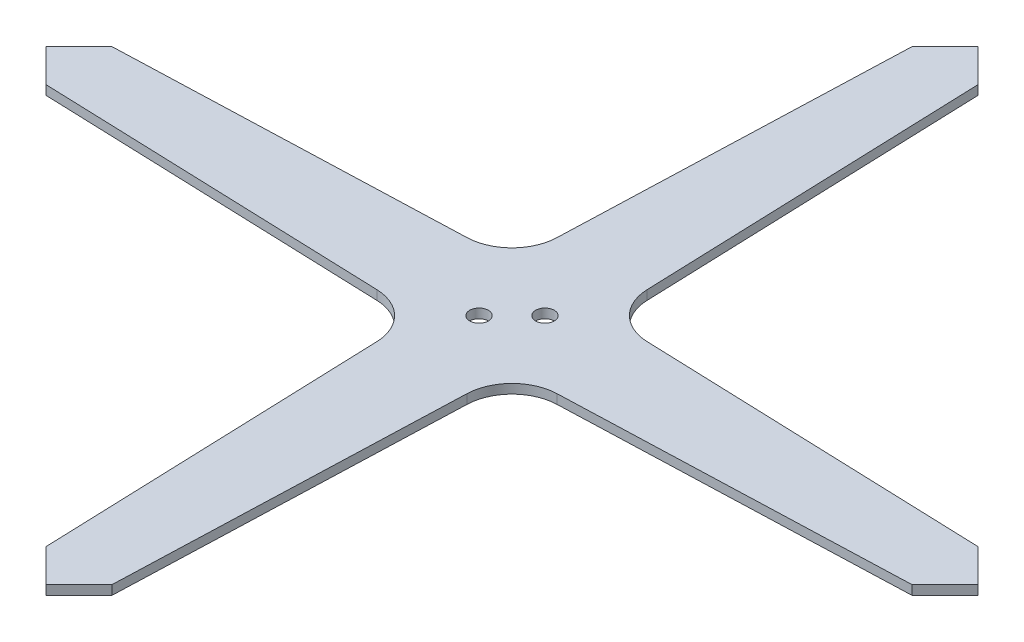
ISO-10303-21;
HEADER;
FILE_DESCRIPTION(('STEP AP214'),'2;1');
FILE_NAME('part.step','',(''),(''),'','','');
FILE_SCHEMA(('AUTOMOTIVE_DESIGN { 1 0 10303 214 1 1 1 1 }'));
ENDSEC;
DATA;
#1=APPLICATION_CONTEXT('core data for automotive mechanical design processes');
#2=APPLICATION_PROTOCOL_DEFINITION('international standard','automotive_design',2000,#1);
#3=PRODUCT_CONTEXT('',#1,'mechanical');
#4=PRODUCT('Part','Part','',(#3));
#5=PRODUCT_RELATED_PRODUCT_CATEGORY('part','',(#4));
#6=PRODUCT_DEFINITION_FORMATION('','',#4);
#7=PRODUCT_DEFINITION_CONTEXT('part definition',#1,'design');
#8=PRODUCT_DEFINITION('design','',#6,#7);
#9=PRODUCT_DEFINITION_SHAPE('','',#8);
#10=(LENGTH_UNIT() NAMED_UNIT(*) SI_UNIT(.MILLI.,.METRE.));
#11=(NAMED_UNIT(*) PLANE_ANGLE_UNIT() SI_UNIT($,.RADIAN.));
#12=(NAMED_UNIT(*) SI_UNIT($,.STERADIAN.) SOLID_ANGLE_UNIT());
#13=UNCERTAINTY_MEASURE_WITH_UNIT(LENGTH_MEASURE(1.E-05),#10,'distance_accuracy_value','');
#14=(GEOMETRIC_REPRESENTATION_CONTEXT(3) GLOBAL_UNCERTAINTY_ASSIGNED_CONTEXT((#13)) GLOBAL_UNIT_ASSIGNED_CONTEXT((#10,
#11,#12)) REPRESENTATION_CONTEXT('',''));
#15=CARTESIAN_POINT('',(0.,0.,0.));
#16=DIRECTION('',(0.,0.,1.));
#17=DIRECTION('',(1.,0.,0.));
#18=AXIS2_PLACEMENT_3D('',#15,#16,#17);
#19=CARTESIAN_POINT('',(0.,3.,0.));
#20=DIRECTION('',(0.,1.,0.));
#21=DIRECTION('',(0.,0.,1.));
#22=AXIS2_PLACEMENT_3D('',#19,#20,#21);
#23=PLANE('',#22);
#24=CARTESIAN_POINT('',(-276.5633008589,3.,5.30330085890187));
#25=DIRECTION('',(0.,1.,0.));
#26=DIRECTION('',(0.,0.,1.));
#27=AXIS2_PLACEMENT_3D('',#24,#25,#26);
#28=CIRCLE('',#27,2.99999999999994);
#29=CARTESIAN_POINT('',(-276.5633008589,3.,8.30330085890181));
#30=VERTEX_POINT('',#29);
#31=EDGE_CURVE('E231',#30,#30,#28,.T.);
#32=ORIENTED_EDGE('',*,*,#31,.F.);
#33=EDGE_LOOP('',(#32));
#34=FACE_BOUND('',#33,.T.);
#35=DIRECTION('',(-0.0352965731020605,0.,0.999376881825496));
#36=VECTOR('',#35,1.);
#37=CARTESIAN_POINT('',(-281.866601717798,3.,-139.393398282199));
#38=LINE('',#37,#36);
#39=CARTESIAN_POINT('',(-281.866601717798,3.,-139.393398282199));
#40=VERTEX_POINT('',#39);
#41=CARTESIAN_POINT('',(-285.766674338683,3.,-28.9678789695326));
#42=VERTEX_POINT('',#41);
#43=EDGE_CURVE('E181',#40,#42,#38,.T.);
#44=ORIENTED_EDGE('',*,*,#43,.T.);
#45=CARTESIAN_POINT('',(-300.757327566065,3.,-29.4973275660635));
#46=DIRECTION('',(0.,1.,0.));
#47=DIRECTION('',(0.,0.,1.));
#48=AXIS2_PLACEMENT_3D('',#45,#46,#47);
#49=CIRCLE('',#48,15.);
#50=CARTESIAN_POINT('',(-300.227878969534,3.,-14.5066743386811));
#51=VERTEX_POINT('',#50);
#52=EDGE_CURVE('E177',#42,#51,#49,.F.);
#53=ORIENTED_EDGE('',*,*,#52,.T.);
#54=DIRECTION('',(-0.999376881825495,0.,0.0352965731020729));
#55=VECTOR('',#54,1.);
#56=CARTESIAN_POINT('',(-286.259999999997,3.,-14.9999999999957));
#57=LINE('',#56,#55);
#58=CARTESIAN_POINT('',(-410.653398282202,3.,-10.6066017177952));
#59=VERTEX_POINT('',#58);
#60=EDGE_CURVE('E169',#51,#59,#57,.T.);
#61=ORIENTED_EDGE('',*,*,#60,.T.);
#62=DIRECTION('',(-0.70710678118655,0.,0.707106781186545));
#63=VECTOR('',#62,1.);
#64=CARTESIAN_POINT('',(-421.26,3.,3.04270497686332E-12));
#65=LINE('',#64,#63);
#66=CARTESIAN_POINT('',(-421.26,3.,3.04270497686332E-12));
#67=VERTEX_POINT('',#66);
#68=EDGE_CURVE('E174',#59,#67,#65,.T.);
#69=ORIENTED_EDGE('',*,*,#68,.T.);
#70=DIRECTION('',(0.70710678118655,0.,0.707106781186545));
#71=VECTOR('',#70,1.);
#72=CARTESIAN_POINT('',(-410.653398282202,3.,10.6066017178012));
#73=LINE('',#72,#71);
#74=CARTESIAN_POINT('',(-410.653398282202,3.,10.6066017178012));
#75=VERTEX_POINT('',#74);
#76=EDGE_CURVE('E196',#67,#75,#73,.T.);
#77=ORIENTED_EDGE('',*,*,#76,.T.);
#78=DIRECTION('',(0.999376881825496,0.,0.03529657310206));
#79=VECTOR('',#78,1.);
#80=CARTESIAN_POINT('',(-410.653398282202,3.,10.6066017178012));
#81=LINE('',#80,#79);
#82=CARTESIAN_POINT('',(-300.227878969536,3.,14.5066743386857));
#83=VERTEX_POINT('',#82);
#84=EDGE_CURVE('E198',#75,#83,#81,.T.);
#85=ORIENTED_EDGE('',*,*,#84,.T.);
#86=CARTESIAN_POINT('',(-300.757327566067,3.,29.4973275660681));
#87=DIRECTION('',(0.,1.,0.));
#88=DIRECTION('',(0.,0.,1.));
#89=AXIS2_PLACEMENT_3D('',#86,#87,#88);
#90=CIRCLE('',#89,15.);
#91=CARTESIAN_POINT('',(-285.766674338684,3.,28.967878969537));
#92=VERTEX_POINT('',#91);
#93=EDGE_CURVE('E319',#83,#92,#90,.F.);
#94=ORIENTED_EDGE('',*,*,#93,.T.);
#95=DIRECTION('',(0.0352965731020734,0.,0.999376881825495));
#96=VECTOR('',#95,1.);
#97=CARTESIAN_POINT('',(-286.259999999999,3.,15.0000000000002));
#98=LINE('',#97,#96);
#99=CARTESIAN_POINT('',(-281.866601717798,3.,139.393398282205));
#100=VERTEX_POINT('',#99);
#101=EDGE_CURVE('E204',#92,#100,#98,.T.);
#102=ORIENTED_EDGE('',*,*,#101,.T.);
#103=DIRECTION('',(0.707106781186542,0.,0.707106781186553));
#104=VECTOR('',#103,1.);
#105=CARTESIAN_POINT('',(-271.26,3.,150.000000000003));
#106=LINE('',#105,#104);
#107=CARTESIAN_POINT('',(-271.26,3.,150.000000000003));
#108=VERTEX_POINT('',#107);
#109=EDGE_CURVE('E206',#100,#108,#106,.T.);
#110=ORIENTED_EDGE('',*,*,#109,.T.);
#111=DIRECTION('',(0.707106781186544,0.,-0.707106781186551));
#112=VECTOR('',#111,1.);
#113=CARTESIAN_POINT('',(-260.653398282202,3.,139.393398282205));
#114=LINE('',#113,#112);
#115=CARTESIAN_POINT('',(-260.653398282202,3.,139.393398282205));
#116=VERTEX_POINT('',#115);
#117=EDGE_CURVE('E208',#108,#116,#114,.T.);
#118=ORIENTED_EDGE('',*,*,#117,.T.);
#119=DIRECTION('',(0.0352965731020596,0.,-0.999376881825496));
#120=VECTOR('',#119,1.);
#121=CARTESIAN_POINT('',(-260.653398282202,3.,139.393398282205));
#122=LINE('',#121,#120);
#123=CARTESIAN_POINT('',(-256.753325661317,3.,28.9678789695386));
#124=VERTEX_POINT('',#123);
#125=EDGE_CURVE('E210',#116,#124,#122,.T.);
#126=ORIENTED_EDGE('',*,*,#125,.T.);
#127=CARTESIAN_POINT('',(-241.762672433935,3.,29.4973275660695));
#128=DIRECTION('',(0.,1.,0.));
#129=DIRECTION('',(0.,0.,1.));
#130=AXIS2_PLACEMENT_3D('',#127,#128,#129);
#131=CIRCLE('',#130,15.);
#132=CARTESIAN_POINT('',(-242.292121030466,3.,14.5066743386871));
#133=VERTEX_POINT('',#132);
#134=EDGE_CURVE('E11',#124,#133,#131,.F.);
#135=ORIENTED_EDGE('',*,*,#134,.T.);
#136=DIRECTION('',(0.999376881825495,0.,-0.0352965731020731));
#137=VECTOR('',#136,1.);
#138=CARTESIAN_POINT('',(-256.260000000003,3.,15.0000000000017));
#139=LINE('',#138,#137);
#140=CARTESIAN_POINT('',(-131.866601717798,3.,10.6066017178011));
#141=VERTEX_POINT('',#140);
#142=EDGE_CURVE('E212',#133,#141,#139,.T.);
#143=ORIENTED_EDGE('',*,*,#142,.T.);
#144=DIRECTION('',(0.707106781186551,0.,-0.707106781186544));
#145=VECTOR('',#144,1.);
#146=CARTESIAN_POINT('',(-121.26,3.,2.98686856498032E-12));
#147=LINE('',#146,#145);
#148=CARTESIAN_POINT('',(-121.26,3.,2.98686856498032E-12));
#149=VERTEX_POINT('',#148);
#150=EDGE_CURVE('E214',#141,#149,#147,.T.);
#151=ORIENTED_EDGE('',*,*,#150,.T.);
#152=DIRECTION('',(-0.707106781186552,0.,-0.707106781186543));
#153=VECTOR('',#152,1.);
#154=CARTESIAN_POINT('',(-131.866601717798,3.,-10.6066017177953));
#155=LINE('',#154,#153);
#156=CARTESIAN_POINT('',(-131.866601717798,3.,-10.6066017177953));
#157=VERTEX_POINT('',#156);
#158=EDGE_CURVE('E216',#149,#157,#155,.T.);
#159=ORIENTED_EDGE('',*,*,#158,.T.);
#160=DIRECTION('',(-0.999376881825496,0.,-0.0352965731020599));
#161=VECTOR('',#160,1.);
#162=CARTESIAN_POINT('',(-131.866601717798,3.,-10.6066017177953));
#163=LINE('',#162,#161);
#164=CARTESIAN_POINT('',(-242.292121030465,3.,-14.5066743386797));
#165=VERTEX_POINT('',#164);
#166=EDGE_CURVE('E218',#157,#165,#163,.T.);
#167=ORIENTED_EDGE('',*,*,#166,.T.);
#168=CARTESIAN_POINT('',(-241.762672433934,3.,-29.4973275660621));
#169=DIRECTION('',(0.,1.,0.));
#170=DIRECTION('',(0.,0.,1.));
#171=AXIS2_PLACEMENT_3D('',#168,#169,#170);
#172=CIRCLE('',#171,15.);
#173=CARTESIAN_POINT('',(-256.753325661316,3.,-28.967878969531));
#174=VERTEX_POINT('',#173);
#175=EDGE_CURVE('E312',#165,#174,#172,.F.);
#176=ORIENTED_EDGE('',*,*,#175,.T.);
#177=DIRECTION('',(-0.035296573102073,0.,-0.999376881825495));
#178=VECTOR('',#177,1.);
#179=CARTESIAN_POINT('',(-256.260000000001,3.,-14.9999999999942));
#180=LINE('',#179,#178);
#181=CARTESIAN_POINT('',(-260.653398282202,3.,-139.393398282199));
#182=VERTEX_POINT('',#181);
#183=EDGE_CURVE('E221',#174,#182,#180,.T.);
#184=ORIENTED_EDGE('',*,*,#183,.T.);
#185=DIRECTION('',(-0.707106781186542,0.,-0.707106781186553));
#186=VECTOR('',#185,1.);
#187=CARTESIAN_POINT('',(-271.26,3.,-149.999999999997));
#188=LINE('',#187,#186);
#189=CARTESIAN_POINT('',(-271.26,3.,-149.999999999997));
#190=VERTEX_POINT('',#189);
#191=EDGE_CURVE('E223',#182,#190,#188,.T.);
#192=ORIENTED_EDGE('',*,*,#191,.T.);
#193=DIRECTION('',(-0.707106781186544,0.,0.707106781186551));
#194=VECTOR('',#193,1.);
#195=CARTESIAN_POINT('',(-281.866601717798,3.,-139.393398282199));
#196=LINE('',#195,#194);
#197=EDGE_CURVE('E225',#190,#40,#196,.T.);
#198=ORIENTED_EDGE('',*,*,#197,.T.);
#199=EDGE_LOOP('',(#44,#53,#61,#69,#77,#85,#94,#102,#110,#118,#126,#135,#143,#151,#159,#167,
#176,#184,#192,#198));
#200=FACE_BOUND('',#199,.T.);
#201=CARTESIAN_POINT('',(-265.956699141101,3.,-5.30330085889581));
#202=DIRECTION('',(0.,1.,0.));
#203=DIRECTION('',(0.,0.,1.));
#204=AXIS2_PLACEMENT_3D('',#201,#202,#203);
#205=CIRCLE('',#204,3.00000000000021);
#206=CARTESIAN_POINT('',(-265.956699141101,3.,-2.3033008588956));
#207=VERTEX_POINT('',#206);
#208=EDGE_CURVE('E551',#207,#207,#205,.T.);
#209=ORIENTED_EDGE('',*,*,#208,.F.);
#210=EDGE_LOOP('',(#209));
#211=FACE_BOUND('',#210,.T.);
#212=ADVANCED_FACE('F33',(#34,#200,#211),#23,.T.);
#213=CARTESIAN_POINT('',(0.,0.,0.));
#214=DIRECTION('',(0.,1.,0.));
#215=DIRECTION('',(0.,0.,1.));
#216=AXIS2_PLACEMENT_3D('',#213,#214,#215);
#217=PLANE('',#216);
#218=DIRECTION('',(-0.0352965731020605,0.,0.999376881825496));
#219=VECTOR('',#218,1.);
#220=CARTESIAN_POINT('',(-281.866601717798,0.,-139.393398282199));
#221=LINE('',#220,#219);
#222=CARTESIAN_POINT('',(-281.866601717798,0.,-139.393398282199));
#223=VERTEX_POINT('',#222);
#224=CARTESIAN_POINT('',(-285.766674338683,0.,-28.9678789695326));
#225=VERTEX_POINT('',#224);
#226=EDGE_CURVE('E228',#223,#225,#221,.T.);
#227=ORIENTED_EDGE('',*,*,#226,.F.);
#228=DIRECTION('',(-0.707106781186544,0.,0.707106781186551));
#229=VECTOR('',#228,1.);
#230=CARTESIAN_POINT('',(-281.866601717798,0.,-139.393398282199));
#231=LINE('',#230,#229);
#232=CARTESIAN_POINT('',(-271.26,0.,-149.999999999997));
#233=VERTEX_POINT('',#232);
#234=EDGE_CURVE('E261',#233,#223,#231,.T.);
#235=ORIENTED_EDGE('',*,*,#234,.F.);
#236=DIRECTION('',(-0.707106781186542,0.,-0.707106781186553));
#237=VECTOR('',#236,1.);
#238=CARTESIAN_POINT('',(-271.26,0.,-149.999999999997));
#239=LINE('',#238,#237);
#240=CARTESIAN_POINT('',(-260.653398282202,0.,-139.393398282199));
#241=VERTEX_POINT('',#240);
#242=EDGE_CURVE('E259',#241,#233,#239,.T.);
#243=ORIENTED_EDGE('',*,*,#242,.F.);
#244=DIRECTION('',(-0.035296573102073,0.,-0.999376881825495));
#245=VECTOR('',#244,1.);
#246=CARTESIAN_POINT('',(-256.260000000001,0.,-14.9999999999942));
#247=LINE('',#246,#245);
#248=CARTESIAN_POINT('',(-256.753325661316,0.,-28.967878969531));
#249=VERTEX_POINT('',#248);
#250=EDGE_CURVE('E257',#249,#241,#247,.T.);
#251=ORIENTED_EDGE('',*,*,#250,.F.);
#252=CARTESIAN_POINT('',(-241.762672433934,0.,-29.4973275660621));
#253=DIRECTION('',(0.,1.,0.));
#254=DIRECTION('',(0.,0.,1.));
#255=AXIS2_PLACEMENT_3D('',#252,#253,#254);
#256=CIRCLE('',#255,15.);
#257=CARTESIAN_POINT('',(-242.292121030465,0.,-14.5066743386797));
#258=VERTEX_POINT('',#257);
#259=EDGE_CURVE('E310',#249,#258,#256,.T.);
#260=ORIENTED_EDGE('',*,*,#259,.T.);
#261=DIRECTION('',(-0.999376881825496,0.,-0.0352965731020599));
#262=VECTOR('',#261,1.);
#263=CARTESIAN_POINT('',(-131.866601717798,0.,-10.6066017177953));
#264=LINE('',#263,#262);
#265=CARTESIAN_POINT('',(-131.866601717798,0.,-10.6066017177953));
#266=VERTEX_POINT('',#265);
#267=EDGE_CURVE('E254',#266,#258,#264,.T.);
#268=ORIENTED_EDGE('',*,*,#267,.F.);
#269=DIRECTION('',(-0.707106781186552,0.,-0.707106781186543));
#270=VECTOR('',#269,1.);
#271=CARTESIAN_POINT('',(-131.866601717798,0.,-10.6066017177953));
#272=LINE('',#271,#270);
#273=CARTESIAN_POINT('',(-121.26,0.,2.98686856498032E-12));
#274=VERTEX_POINT('',#273);
#275=EDGE_CURVE('E252',#274,#266,#272,.T.);
#276=ORIENTED_EDGE('',*,*,#275,.F.);
#277=DIRECTION('',(0.707106781186551,0.,-0.707106781186544));
#278=VECTOR('',#277,1.);
#279=CARTESIAN_POINT('',(-121.26,0.,2.98686856498032E-12));
#280=LINE('',#279,#278);
#281=CARTESIAN_POINT('',(-131.866601717798,0.,10.6066017178011));
#282=VERTEX_POINT('',#281);
#283=EDGE_CURVE('E250',#282,#274,#280,.T.);
#284=ORIENTED_EDGE('',*,*,#283,.F.);
#285=DIRECTION('',(0.999376881825495,0.,-0.0352965731020731));
#286=VECTOR('',#285,1.);
#287=CARTESIAN_POINT('',(-256.260000000003,0.,15.0000000000017));
#288=LINE('',#287,#286);
#289=CARTESIAN_POINT('',(-242.292121030466,0.,14.5066743386871));
#290=VERTEX_POINT('',#289);
#291=EDGE_CURVE('E248',#290,#282,#288,.T.);
#292=ORIENTED_EDGE('',*,*,#291,.F.);
#293=CARTESIAN_POINT('',(-241.762672433935,0.,29.4973275660695));
#294=DIRECTION('',(0.,1.,0.));
#295=DIRECTION('',(0.,0.,1.));
#296=AXIS2_PLACEMENT_3D('',#293,#294,#295);
#297=CIRCLE('',#296,15.);
#298=CARTESIAN_POINT('',(-256.753325661317,0.,28.9678789695386));
#299=VERTEX_POINT('',#298);
#300=EDGE_CURVE('E41',#290,#299,#297,.T.);
#301=ORIENTED_EDGE('',*,*,#300,.T.);
#302=DIRECTION('',(0.0352965731020596,0.,-0.999376881825496));
#303=VECTOR('',#302,1.);
#304=CARTESIAN_POINT('',(-260.653398282202,0.,139.393398282205));
#305=LINE('',#304,#303);
#306=CARTESIAN_POINT('',(-260.653398282202,0.,139.393398282205));
#307=VERTEX_POINT('',#306);
#308=EDGE_CURVE('E246',#307,#299,#305,.T.);
#309=ORIENTED_EDGE('',*,*,#308,.F.);
#310=DIRECTION('',(0.707106781186544,0.,-0.707106781186551));
#311=VECTOR('',#310,1.);
#312=CARTESIAN_POINT('',(-260.653398282202,0.,139.393398282205));
#313=LINE('',#312,#311);
#314=CARTESIAN_POINT('',(-271.26,0.,150.000000000003));
#315=VERTEX_POINT('',#314);
#316=EDGE_CURVE('E244',#315,#307,#313,.T.);
#317=ORIENTED_EDGE('',*,*,#316,.F.);
#318=DIRECTION('',(0.707106781186542,0.,0.707106781186553));
#319=VECTOR('',#318,1.);
#320=CARTESIAN_POINT('',(-271.26,0.,150.000000000003));
#321=LINE('',#320,#319);
#322=CARTESIAN_POINT('',(-281.866601717798,0.,139.393398282205));
#323=VERTEX_POINT('',#322);
#324=EDGE_CURVE('E242',#323,#315,#321,.T.);
#325=ORIENTED_EDGE('',*,*,#324,.F.);
#326=DIRECTION('',(0.0352965731020734,0.,0.999376881825495));
#327=VECTOR('',#326,1.);
#328=CARTESIAN_POINT('',(-286.259999999999,0.,15.0000000000002));
#329=LINE('',#328,#327);
#330=CARTESIAN_POINT('',(-285.766674338684,0.,28.967878969537));
#331=VERTEX_POINT('',#330);
#332=EDGE_CURVE('E240',#331,#323,#329,.T.);
#333=ORIENTED_EDGE('',*,*,#332,.F.);
#334=CARTESIAN_POINT('',(-300.757327566067,0.,29.4973275660681));
#335=DIRECTION('',(0.,1.,0.));
#336=DIRECTION('',(0.,0.,1.));
#337=AXIS2_PLACEMENT_3D('',#334,#335,#336);
#338=CIRCLE('',#337,15.);
#339=CARTESIAN_POINT('',(-300.227878969536,0.,14.5066743386857));
#340=VERTEX_POINT('',#339);
#341=EDGE_CURVE('E317',#331,#340,#338,.T.);
#342=ORIENTED_EDGE('',*,*,#341,.T.);
#343=DIRECTION('',(0.999376881825496,0.,0.03529657310206));
#344=VECTOR('',#343,1.);
#345=CARTESIAN_POINT('',(-410.653398282202,0.,10.6066017178012));
#346=LINE('',#345,#344);
#347=CARTESIAN_POINT('',(-410.653398282202,0.,10.6066017178012));
#348=VERTEX_POINT('',#347);
#349=EDGE_CURVE('E237',#348,#340,#346,.T.);
#350=ORIENTED_EDGE('',*,*,#349,.F.);
#351=DIRECTION('',(0.70710678118655,0.,0.707106781186545));
#352=VECTOR('',#351,1.);
#353=CARTESIAN_POINT('',(-410.653398282202,0.,10.6066017178012));
#354=LINE('',#353,#352);
#355=CARTESIAN_POINT('',(-421.26,0.,3.04270497686332E-12));
#356=VERTEX_POINT('',#355);
#357=EDGE_CURVE('E235',#356,#348,#354,.T.);
#358=ORIENTED_EDGE('',*,*,#357,.F.);
#359=DIRECTION('',(-0.70710678118655,0.,0.707106781186545));
#360=VECTOR('',#359,1.);
#361=CARTESIAN_POINT('',(-421.26,0.,3.04270497686332E-12));
#362=LINE('',#361,#360);
#363=CARTESIAN_POINT('',(-410.653398282202,0.,-10.6066017177952));
#364=VERTEX_POINT('',#363);
#365=EDGE_CURVE('E233',#364,#356,#362,.T.);
#366=ORIENTED_EDGE('',*,*,#365,.F.);
#367=DIRECTION('',(-0.999376881825495,0.,0.0352965731020729));
#368=VECTOR('',#367,1.);
#369=CARTESIAN_POINT('',(-286.259999999997,0.,-14.9999999999957));
#370=LINE('',#369,#368);
#371=CARTESIAN_POINT('',(-300.227878969534,0.,-14.5066743386811));
#372=VERTEX_POINT('',#371);
#373=EDGE_CURVE('E187',#372,#364,#370,.T.);
#374=ORIENTED_EDGE('',*,*,#373,.F.);
#375=CARTESIAN_POINT('',(-300.757327566065,0.,-29.4973275660635));
#376=DIRECTION('',(0.,1.,0.));
#377=DIRECTION('',(0.,0.,1.));
#378=AXIS2_PLACEMENT_3D('',#375,#376,#377);
#379=CIRCLE('',#378,15.);
#380=EDGE_CURVE('E314',#372,#225,#379,.T.);
#381=ORIENTED_EDGE('',*,*,#380,.T.);
#382=EDGE_LOOP('',(#227,#235,#243,#251,#260,#268,#276,#284,#292,#301,#309,#317,#325,#333,#342,
#350,#358,#366,#374,#381));
#383=FACE_BOUND('',#382,.T.);
#384=CARTESIAN_POINT('',(-276.5633008589,0.,5.30330085890187));
#385=DIRECTION('',(0.,1.,0.));
#386=DIRECTION('',(0.,0.,1.));
#387=AXIS2_PLACEMENT_3D('',#384,#385,#386);
#388=CIRCLE('',#387,2.99999999999994);
#389=CARTESIAN_POINT('',(-276.5633008589,0.,8.30330085890181));
#390=VERTEX_POINT('',#389);
#391=EDGE_CURVE('E548',#390,#390,#388,.T.);
#392=ORIENTED_EDGE('',*,*,#391,.T.);
#393=EDGE_LOOP('',(#392));
#394=FACE_BOUND('',#393,.T.);
#395=CARTESIAN_POINT('',(-265.956699141101,0.,-5.30330085889581));
#396=DIRECTION('',(0.,1.,0.));
#397=DIRECTION('',(0.,0.,1.));
#398=AXIS2_PLACEMENT_3D('',#395,#396,#397);
#399=CIRCLE('',#398,3.00000000000021);
#400=CARTESIAN_POINT('',(-265.956699141101,0.,-2.3033008588956));
#401=VERTEX_POINT('',#400);
#402=EDGE_CURVE('E554',#401,#401,#399,.T.);
#403=ORIENTED_EDGE('',*,*,#402,.T.);
#404=EDGE_LOOP('',(#403));
#405=FACE_BOUND('',#404,.T.);
#406=ADVANCED_FACE('F334',(#383,#394,#405),#217,.F.);
#407=CARTESIAN_POINT('',(-281.866601717798,3.,-139.393398282199));
#408=DIRECTION('',(0.999376881825496,0.,0.0352965731020605));
#409=DIRECTION('',(0.0352965731020605,0.,-0.999376881825496));
#410=AXIS2_PLACEMENT_3D('',#407,#408,#409);
#411=PLANE('',#410);
#412=ORIENTED_EDGE('',*,*,#226,.T.);
#413=DIRECTION('',(0.,-1.,0.));
#414=VECTOR('',#413,1.);
#415=CARTESIAN_POINT('',(-285.766674338683,3.,-28.9678789695326));
#416=LINE('',#415,#414);
#417=EDGE_CURVE('E299',#225,#42,#416,.F.);
#418=ORIENTED_EDGE('',*,*,#417,.T.);
#419=ORIENTED_EDGE('',*,*,#43,.F.);
#420=DIRECTION('',(0.,-1.,0.));
#421=VECTOR('',#420,1.);
#422=CARTESIAN_POINT('',(-281.866601717798,3.,-139.393398282199));
#423=LINE('',#422,#421);
#424=EDGE_CURVE('E227',#40,#223,#423,.T.);
#425=ORIENTED_EDGE('',*,*,#424,.T.);
#426=EDGE_LOOP('',(#412,#418,#419,#425));
#427=FACE_BOUND('',#426,.T.);
#428=ADVANCED_FACE('F347',(#427),#411,.F.);
#429=CARTESIAN_POINT('',(-286.259999999997,3.,-14.9999999999957));
#430=DIRECTION('',(0.0352965731020729,0.,0.999376881825495));
#431=DIRECTION('',(0.999376881825495,0.,-0.0352965731020729));
#432=AXIS2_PLACEMENT_3D('',#429,#430,#431);
#433=PLANE('',#432);
#434=ORIENTED_EDGE('',*,*,#60,.F.);
#435=DIRECTION('',(0.,-1.,0.));
#436=VECTOR('',#435,1.);
#437=CARTESIAN_POINT('',(-300.227878969534,0.,-14.5066743386811));
#438=LINE('',#437,#436);
#439=EDGE_CURVE('E297',#51,#372,#438,.T.);
#440=ORIENTED_EDGE('',*,*,#439,.T.);
#441=ORIENTED_EDGE('',*,*,#373,.T.);
#442=DIRECTION('',(0.,-1.,0.));
#443=VECTOR('',#442,1.);
#444=CARTESIAN_POINT('',(-410.653398282202,3.,-10.6066017177952));
#445=LINE('',#444,#443);
#446=EDGE_CURVE('E184',#59,#364,#445,.T.);
#447=ORIENTED_EDGE('',*,*,#446,.F.);
#448=EDGE_LOOP('',(#434,#440,#441,#447));
#449=FACE_BOUND('',#448,.T.);
#450=ADVANCED_FACE('F185',(#449),#433,.F.);
#451=CARTESIAN_POINT('',(-421.26,3.,3.04270497686332E-12));
#452=DIRECTION('',(0.707106781186545,0.,0.70710678118655));
#453=DIRECTION('',(0.70710678118655,0.,-0.707106781186545));
#454=AXIS2_PLACEMENT_3D('',#451,#452,#453);
#455=PLANE('',#454);
#456=ORIENTED_EDGE('',*,*,#365,.T.);
#457=DIRECTION('',(0.,-1.,0.));
#458=VECTOR('',#457,1.);
#459=CARTESIAN_POINT('',(-421.26,3.,3.04270497686332E-12));
#460=LINE('',#459,#458);
#461=EDGE_CURVE('E191',#67,#356,#460,.T.);
#462=ORIENTED_EDGE('',*,*,#461,.F.);
#463=ORIENTED_EDGE('',*,*,#68,.F.);
#464=ORIENTED_EDGE('',*,*,#446,.T.);
#465=EDGE_LOOP('',(#456,#462,#463,#464));
#466=FACE_BOUND('',#465,.T.);
#467=ADVANCED_FACE('F193',(#466),#455,.F.);
#468=CARTESIAN_POINT('',(-410.653398282202,3.,10.6066017178012));
#469=DIRECTION('',(0.707106781186545,0.,-0.70710678118655));
#470=DIRECTION('',(-0.70710678118655,0.,-0.707106781186545));
#471=AXIS2_PLACEMENT_3D('',#468,#469,#470);
#472=PLANE('',#471);
#473=ORIENTED_EDGE('',*,*,#357,.T.);
#474=DIRECTION('',(0.,-1.,0.));
#475=VECTOR('',#474,1.);
#476=CARTESIAN_POINT('',(-410.653398282202,3.,10.6066017178012));
#477=LINE('',#476,#475);
#478=EDGE_CURVE('E289',#75,#348,#477,.T.);
#479=ORIENTED_EDGE('',*,*,#478,.F.);
#480=ORIENTED_EDGE('',*,*,#76,.F.);
#481=ORIENTED_EDGE('',*,*,#461,.T.);
#482=EDGE_LOOP('',(#473,#479,#480,#481));
#483=FACE_BOUND('',#482,.T.);
#484=ADVANCED_FACE('F342',(#483),#472,.F.);
#485=CARTESIAN_POINT('',(-410.653398282202,3.,10.6066017178012));
#486=DIRECTION('',(0.03529657310206,0.,-0.999376881825496));
#487=DIRECTION('',(-0.999376881825496,0.,-0.03529657310206));
#488=AXIS2_PLACEMENT_3D('',#485,#486,#487);
#489=PLANE('',#488);
#490=ORIENTED_EDGE('',*,*,#349,.T.);
#491=DIRECTION('',(0.,-1.,0.));
#492=VECTOR('',#491,1.);
#493=CARTESIAN_POINT('',(-300.227878969536,3.,14.5066743386857));
#494=LINE('',#493,#492);
#495=EDGE_CURVE('E304',#340,#83,#494,.F.);
#496=ORIENTED_EDGE('',*,*,#495,.T.);
#497=ORIENTED_EDGE('',*,*,#84,.F.);
#498=ORIENTED_EDGE('',*,*,#478,.T.);
#499=EDGE_LOOP('',(#490,#496,#497,#498));
#500=FACE_BOUND('',#499,.T.);
#501=ADVANCED_FACE('F339',(#500),#489,.F.);
#502=CARTESIAN_POINT('',(-286.259999999999,3.,15.0000000000002));
#503=DIRECTION('',(0.999376881825495,0.,-0.0352965731020734));
#504=DIRECTION('',(-0.0352965731020734,0.,-0.999376881825495));
#505=AXIS2_PLACEMENT_3D('',#502,#503,#504);
#506=PLANE('',#505);
#507=ORIENTED_EDGE('',*,*,#101,.F.);
#508=DIRECTION('',(0.,-1.,0.));
#509=VECTOR('',#508,1.);
#510=CARTESIAN_POINT('',(-285.766674338684,0.,28.967878969537));
#511=LINE('',#510,#509);
#512=EDGE_CURVE('E301',#92,#331,#511,.T.);
#513=ORIENTED_EDGE('',*,*,#512,.T.);
#514=ORIENTED_EDGE('',*,*,#332,.T.);
#515=DIRECTION('',(0.,-1.,0.));
#516=VECTOR('',#515,1.);
#517=CARTESIAN_POINT('',(-281.866601717798,3.,139.393398282205));
#518=LINE('',#517,#516);
#519=EDGE_CURVE('E286',#100,#323,#518,.T.);
#520=ORIENTED_EDGE('',*,*,#519,.F.);
#521=EDGE_LOOP('',(#507,#513,#514,#520));
#522=FACE_BOUND('',#521,.T.);
#523=ADVANCED_FACE('F328',(#522),#506,.F.);
#524=CARTESIAN_POINT('',(-271.26,3.,150.000000000003));
#525=DIRECTION('',(0.707106781186553,0.,-0.707106781186542));
#526=DIRECTION('',(-0.707106781186542,0.,-0.707106781186553));
#527=AXIS2_PLACEMENT_3D('',#524,#525,#526);
#528=PLANE('',#527);
#529=ORIENTED_EDGE('',*,*,#324,.T.);
#530=DIRECTION('',(0.,-1.,0.));
#531=VECTOR('',#530,1.);
#532=CARTESIAN_POINT('',(-271.26,3.,150.000000000003));
#533=LINE('',#532,#531);
#534=EDGE_CURVE('E283',#108,#315,#533,.T.);
#535=ORIENTED_EDGE('',*,*,#534,.F.);
#536=ORIENTED_EDGE('',*,*,#109,.F.);
#537=ORIENTED_EDGE('',*,*,#519,.T.);
#538=EDGE_LOOP('',(#529,#535,#536,#537));
#539=FACE_BOUND('',#538,.T.);
#540=ADVANCED_FACE('F407',(#539),#528,.F.);
#541=CARTESIAN_POINT('',(-260.653398282202,3.,139.393398282205));
#542=DIRECTION('',(-0.707106781186551,0.,-0.707106781186544));
#543=DIRECTION('',(-0.707106781186544,0.,0.707106781186551));
#544=AXIS2_PLACEMENT_3D('',#541,#542,#543);
#545=PLANE('',#544);
#546=ORIENTED_EDGE('',*,*,#316,.T.);
#547=DIRECTION('',(0.,-1.,0.));
#548=VECTOR('',#547,1.);
#549=CARTESIAN_POINT('',(-260.653398282202,3.,139.393398282205));
#550=LINE('',#549,#548);
#551=EDGE_CURVE('E280',#116,#307,#550,.T.);
#552=ORIENTED_EDGE('',*,*,#551,.F.);
#553=ORIENTED_EDGE('',*,*,#117,.F.);
#554=ORIENTED_EDGE('',*,*,#534,.T.);
#555=EDGE_LOOP('',(#546,#552,#553,#554));
#556=FACE_BOUND('',#555,.T.);
#557=ADVANCED_FACE('F404',(#556),#545,.F.);
#558=CARTESIAN_POINT('',(-260.653398282202,3.,139.393398282205));
#559=DIRECTION('',(-0.999376881825496,0.,-0.0352965731020596));
#560=DIRECTION('',(-0.0352965731020596,0.,0.999376881825496));
#561=AXIS2_PLACEMENT_3D('',#558,#559,#560);
#562=PLANE('',#561);
#563=ORIENTED_EDGE('',*,*,#308,.T.);
#564=DIRECTION('',(0.,-1.,0.));
#565=VECTOR('',#564,1.);
#566=CARTESIAN_POINT('',(-256.753325661317,3.,28.9678789695386));
#567=LINE('',#566,#565);
#568=EDGE_CURVE('E48',#299,#124,#567,.F.);
#569=ORIENTED_EDGE('',*,*,#568,.T.);
#570=ORIENTED_EDGE('',*,*,#125,.F.);
#571=ORIENTED_EDGE('',*,*,#551,.T.);
#572=EDGE_LOOP('',(#563,#569,#570,#571));
#573=FACE_BOUND('',#572,.T.);
#574=ADVANCED_FACE('F400',(#573),#562,.F.);
#575=CARTESIAN_POINT('',(-256.260000000003,3.,15.0000000000017));
#576=DIRECTION('',(-0.0352965731020731,0.,-0.999376881825495));
#577=DIRECTION('',(-0.999376881825495,0.,0.0352965731020731));
#578=AXIS2_PLACEMENT_3D('',#575,#576,#577);
#579=PLANE('',#578);
#580=ORIENTED_EDGE('',*,*,#142,.F.);
#581=DIRECTION('',(0.,-1.,0.));
#582=VECTOR('',#581,1.);
#583=CARTESIAN_POINT('',(-242.292121030466,0.,14.5066743386871));
#584=LINE('',#583,#582);
#585=EDGE_CURVE('E306',#133,#290,#584,.T.);
#586=ORIENTED_EDGE('',*,*,#585,.T.);
#587=ORIENTED_EDGE('',*,*,#291,.T.);
#588=DIRECTION('',(0.,-1.,0.));
#589=VECTOR('',#588,1.);
#590=CARTESIAN_POINT('',(-131.866601717798,3.,10.6066017178011));
#591=LINE('',#590,#589);
#592=EDGE_CURVE('E277',#141,#282,#591,.T.);
#593=ORIENTED_EDGE('',*,*,#592,.F.);
#594=EDGE_LOOP('',(#580,#586,#587,#593));
#595=FACE_BOUND('',#594,.T.);
#596=ADVANCED_FACE('F396',(#595),#579,.F.);
#597=CARTESIAN_POINT('',(-121.26,3.,2.98686856498032E-12));
#598=DIRECTION('',(-0.707106781186544,0.,-0.707106781186551));
#599=DIRECTION('',(-0.707106781186551,0.,0.707106781186544));
#600=AXIS2_PLACEMENT_3D('',#597,#598,#599);
#601=PLANE('',#600);
#602=ORIENTED_EDGE('',*,*,#283,.T.);
#603=DIRECTION('',(0.,-1.,0.));
#604=VECTOR('',#603,1.);
#605=CARTESIAN_POINT('',(-121.26,3.,2.98686856498032E-12));
#606=LINE('',#605,#604);
#607=EDGE_CURVE('E274',#149,#274,#606,.T.);
#608=ORIENTED_EDGE('',*,*,#607,.F.);
#609=ORIENTED_EDGE('',*,*,#150,.F.);
#610=ORIENTED_EDGE('',*,*,#592,.T.);
#611=EDGE_LOOP('',(#602,#608,#609,#610));
#612=FACE_BOUND('',#611,.T.);
#613=ADVANCED_FACE('F392',(#612),#601,.F.);
#614=CARTESIAN_POINT('',(-131.866601717798,3.,-10.6066017177953));
#615=DIRECTION('',(-0.707106781186543,0.,0.707106781186552));
#616=DIRECTION('',(0.707106781186552,0.,0.707106781186543));
#617=AXIS2_PLACEMENT_3D('',#614,#615,#616);
#618=PLANE('',#617);
#619=ORIENTED_EDGE('',*,*,#275,.T.);
#620=DIRECTION('',(0.,-1.,0.));
#621=VECTOR('',#620,1.);
#622=CARTESIAN_POINT('',(-131.866601717798,3.,-10.6066017177953));
#623=LINE('',#622,#621);
#624=EDGE_CURVE('E271',#157,#266,#623,.T.);
#625=ORIENTED_EDGE('',*,*,#624,.F.);
#626=ORIENTED_EDGE('',*,*,#158,.F.);
#627=ORIENTED_EDGE('',*,*,#607,.T.);
#628=EDGE_LOOP('',(#619,#625,#626,#627));
#629=FACE_BOUND('',#628,.T.);
#630=ADVANCED_FACE('F388',(#629),#618,.F.);
#631=CARTESIAN_POINT('',(-131.866601717798,3.,-10.6066017177953));
#632=DIRECTION('',(-0.0352965731020599,0.,0.999376881825496));
#633=DIRECTION('',(0.999376881825496,0.,0.0352965731020599));
#634=AXIS2_PLACEMENT_3D('',#631,#632,#633);
#635=PLANE('',#634);
#636=ORIENTED_EDGE('',*,*,#267,.T.);
#637=DIRECTION('',(0.,-1.,0.));
#638=VECTOR('',#637,1.);
#639=CARTESIAN_POINT('',(-242.292121030465,3.,-14.5066743386797));
#640=LINE('',#639,#638);
#641=EDGE_CURVE('E295',#258,#165,#640,.F.);
#642=ORIENTED_EDGE('',*,*,#641,.T.);
#643=ORIENTED_EDGE('',*,*,#166,.F.);
#644=ORIENTED_EDGE('',*,*,#624,.T.);
#645=EDGE_LOOP('',(#636,#642,#643,#644));
#646=FACE_BOUND('',#645,.T.);
#647=ADVANCED_FACE('F384',(#646),#635,.F.);
#648=CARTESIAN_POINT('',(-256.260000000001,3.,-14.9999999999942));
#649=DIRECTION('',(-0.999376881825495,0.,0.035296573102073));
#650=DIRECTION('',(0.035296573102073,0.,0.999376881825495));
#651=AXIS2_PLACEMENT_3D('',#648,#649,#650);
#652=PLANE('',#651);
#653=ORIENTED_EDGE('',*,*,#183,.F.);
#654=DIRECTION('',(0.,-1.,0.));
#655=VECTOR('',#654,1.);
#656=CARTESIAN_POINT('',(-256.753325661316,0.,-28.967878969531));
#657=LINE('',#656,#655);
#658=EDGE_CURVE('E190',#174,#249,#657,.T.);
#659=ORIENTED_EDGE('',*,*,#658,.T.);
#660=ORIENTED_EDGE('',*,*,#250,.T.);
#661=DIRECTION('',(0.,-1.,0.));
#662=VECTOR('',#661,1.);
#663=CARTESIAN_POINT('',(-260.653398282202,3.,-139.393398282199));
#664=LINE('',#663,#662);
#665=EDGE_CURVE('E268',#182,#241,#664,.T.);
#666=ORIENTED_EDGE('',*,*,#665,.F.);
#667=EDGE_LOOP('',(#653,#659,#660,#666));
#668=FACE_BOUND('',#667,.T.);
#669=ADVANCED_FACE('F380',(#668),#652,.F.);
#670=CARTESIAN_POINT('',(-271.26,3.,-149.999999999997));
#671=DIRECTION('',(-0.707106781186553,0.,0.707106781186542));
#672=DIRECTION('',(0.707106781186542,0.,0.707106781186553));
#673=AXIS2_PLACEMENT_3D('',#670,#671,#672);
#674=PLANE('',#673);
#675=ORIENTED_EDGE('',*,*,#242,.T.);
#676=DIRECTION('',(0.,-1.,0.));
#677=VECTOR('',#676,1.);
#678=CARTESIAN_POINT('',(-271.26,3.,-149.999999999997));
#679=LINE('',#678,#677);
#680=EDGE_CURVE('E265',#190,#233,#679,.T.);
#681=ORIENTED_EDGE('',*,*,#680,.F.);
#682=ORIENTED_EDGE('',*,*,#191,.F.);
#683=ORIENTED_EDGE('',*,*,#665,.T.);
#684=EDGE_LOOP('',(#675,#681,#682,#683));
#685=FACE_BOUND('',#684,.T.);
#686=ADVANCED_FACE('F376',(#685),#674,.F.);
#687=CARTESIAN_POINT('',(-281.866601717798,3.,-139.393398282199));
#688=DIRECTION('',(0.707106781186551,0.,0.707106781186544));
#689=DIRECTION('',(0.707106781186544,0.,-0.707106781186551));
#690=AXIS2_PLACEMENT_3D('',#687,#688,#689);
#691=PLANE('',#690);
#692=ORIENTED_EDGE('',*,*,#234,.T.);
#693=ORIENTED_EDGE('',*,*,#424,.F.);
#694=ORIENTED_EDGE('',*,*,#197,.F.);
#695=ORIENTED_EDGE('',*,*,#680,.T.);
#696=EDGE_LOOP('',(#692,#693,#694,#695));
#697=FACE_BOUND('',#696,.T.);
#698=ADVANCED_FACE('F373',(#697),#691,.F.);
#699=CARTESIAN_POINT('',(-276.5633008589,3.,5.30330085890187));
#700=DIRECTION('',(0.,-1.,0.));
#701=DIRECTION('',(0.,0.,-1.));
#702=AXIS2_PLACEMENT_3D('',#699,#700,#701);
#703=CYLINDRICAL_SURFACE('',#702,2.99999999999994);
#704=ORIENTED_EDGE('',*,*,#31,.T.);
#705=EDGE_LOOP('',(#704));
#706=FACE_BOUND('',#705,.T.);
#707=ORIENTED_EDGE('',*,*,#391,.F.);
#708=EDGE_LOOP('',(#707));
#709=FACE_BOUND('',#708,.T.);
#710=ADVANCED_FACE('F370',(#706,#709),#703,.F.);
#711=CARTESIAN_POINT('',(-265.956699141101,3.,-5.30330085889581));
#712=DIRECTION('',(0.,-1.,0.));
#713=DIRECTION('',(0.,0.,-1.));
#714=AXIS2_PLACEMENT_3D('',#711,#712,#713);
#715=CYLINDRICAL_SURFACE('',#714,3.00000000000021);
#716=ORIENTED_EDGE('',*,*,#208,.T.);
#717=EDGE_LOOP('',(#716));
#718=FACE_BOUND('',#717,.T.);
#719=ORIENTED_EDGE('',*,*,#402,.F.);
#720=EDGE_LOOP('',(#719));
#721=FACE_BOUND('',#720,.T.);
#722=ADVANCED_FACE('F358',(#718,#721),#715,.F.);
#723=CARTESIAN_POINT('',(-241.762672433934,3.,-29.4973275660621));
#724=DIRECTION('',(0.,1.,0.));
#725=DIRECTION('',(0.,0.,1.));
#726=AXIS2_PLACEMENT_3D('',#723,#724,#725);
#727=CYLINDRICAL_SURFACE('',#726,15.);
#728=ORIENTED_EDGE('',*,*,#175,.F.);
#729=ORIENTED_EDGE('',*,*,#641,.F.);
#730=ORIENTED_EDGE('',*,*,#259,.F.);
#731=ORIENTED_EDGE('',*,*,#658,.F.);
#732=EDGE_LOOP('',(#728,#729,#730,#731));
#733=FACE_BOUND('',#732,.T.);
#734=ADVANCED_FACE('F352',(#733),#727,.F.);
#735=CARTESIAN_POINT('',(-300.757327566065,3.,-29.4973275660635));
#736=DIRECTION('',(0.,1.,0.));
#737=DIRECTION('',(0.,0.,1.));
#738=AXIS2_PLACEMENT_3D('',#735,#736,#737);
#739=CYLINDRICAL_SURFACE('',#738,15.);
#740=ORIENTED_EDGE('',*,*,#52,.F.);
#741=ORIENTED_EDGE('',*,*,#417,.F.);
#742=ORIENTED_EDGE('',*,*,#380,.F.);
#743=ORIENTED_EDGE('',*,*,#439,.F.);
#744=EDGE_LOOP('',(#740,#741,#742,#743));
#745=FACE_BOUND('',#744,.T.);
#746=ADVANCED_FACE('F350',(#745),#739,.F.);
#747=CARTESIAN_POINT('',(-300.757327566067,3.,29.4973275660681));
#748=DIRECTION('',(0.,1.,0.));
#749=DIRECTION('',(0.,0.,1.));
#750=AXIS2_PLACEMENT_3D('',#747,#748,#749);
#751=CYLINDRICAL_SURFACE('',#750,15.);
#752=ORIENTED_EDGE('',*,*,#93,.F.);
#753=ORIENTED_EDGE('',*,*,#495,.F.);
#754=ORIENTED_EDGE('',*,*,#341,.F.);
#755=ORIENTED_EDGE('',*,*,#512,.F.);
#756=EDGE_LOOP('',(#752,#753,#754,#755));
#757=FACE_BOUND('',#756,.T.);
#758=ADVANCED_FACE('F331',(#757),#751,.F.);
#759=CARTESIAN_POINT('',(-241.762672433935,3.,29.4973275660695));
#760=DIRECTION('',(0.,1.,0.));
#761=DIRECTION('',(0.,0.,1.));
#762=AXIS2_PLACEMENT_3D('',#759,#760,#761);
#763=CYLINDRICAL_SURFACE('',#762,15.);
#764=ORIENTED_EDGE('',*,*,#134,.F.);
#765=ORIENTED_EDGE('',*,*,#568,.F.);
#766=ORIENTED_EDGE('',*,*,#300,.F.);
#767=ORIENTED_EDGE('',*,*,#585,.F.);
#768=EDGE_LOOP('',(#764,#765,#766,#767));
#769=FACE_BOUND('',#768,.T.);
#770=ADVANCED_FACE('F35',(#769),#763,.F.);
#771=CLOSED_SHELL('',(#212,#406,#428,#450,#467,#484,#501,#523,#540,#557,#574,#596,#613,#630,
#647,#669,#686,#698,#710,#722,#734,#746,#758,#770));
#772=MANIFOLD_SOLID_BREP('B2',#771);
#773=ADVANCED_BREP_SHAPE_REPRESENTATION('',(#18,#772),#14);
#774=SHAPE_DEFINITION_REPRESENTATION(#9,#773);
ENDSEC;
END-ISO-10303-21;
